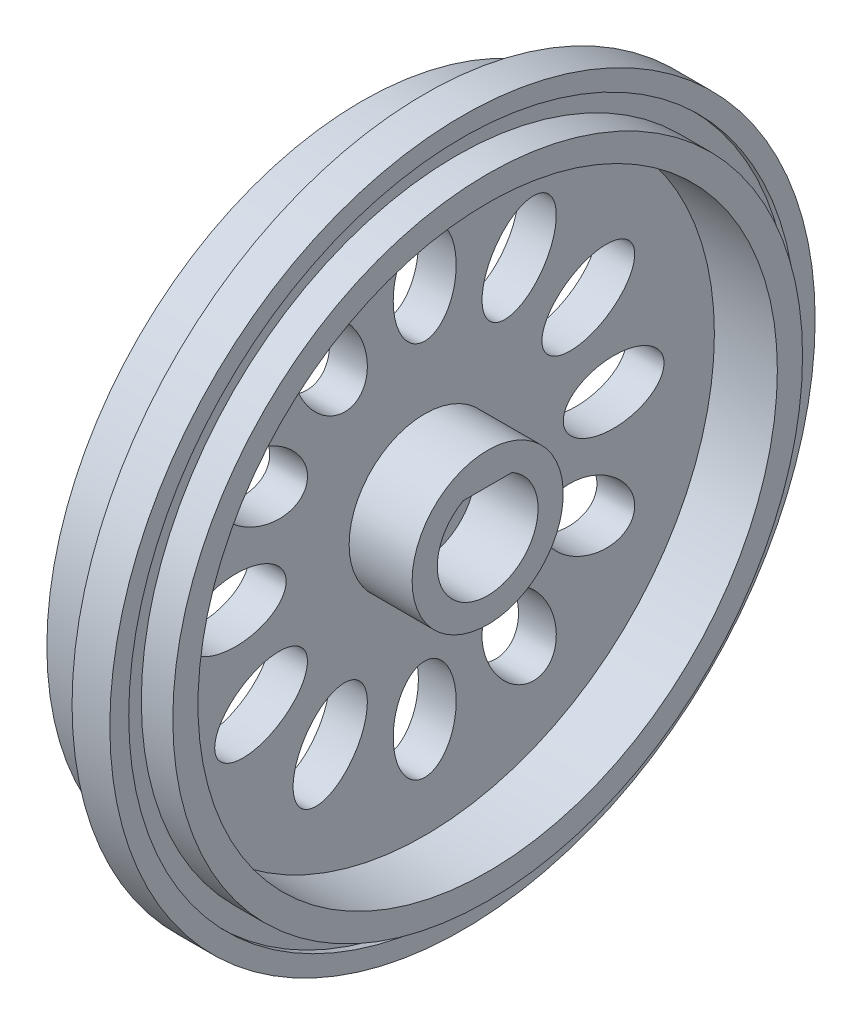
ISO-10303-21;
HEADER;
FILE_DESCRIPTION(('STEP AP214'),'2;1');
FILE_NAME('part.step','',(''),(''),'','','');
FILE_SCHEMA(('AUTOMOTIVE_DESIGN { 1 0 10303 214 1 1 1 1 }'));
ENDSEC;
DATA;
#1=APPLICATION_CONTEXT('core data for automotive mechanical design processes');
#2=APPLICATION_PROTOCOL_DEFINITION('international standard','automotive_design',2000,#1);
#3=PRODUCT_CONTEXT('',#1,'mechanical');
#4=PRODUCT('Part','Part','',(#3));
#5=PRODUCT_RELATED_PRODUCT_CATEGORY('part','',(#4));
#6=PRODUCT_DEFINITION_FORMATION('','',#4);
#7=PRODUCT_DEFINITION_CONTEXT('part definition',#1,'design');
#8=PRODUCT_DEFINITION('design','',#6,#7);
#9=PRODUCT_DEFINITION_SHAPE('','',#8);
#10=(LENGTH_UNIT() NAMED_UNIT(*) SI_UNIT(.MILLI.,.METRE.));
#11=(NAMED_UNIT(*) PLANE_ANGLE_UNIT() SI_UNIT($,.RADIAN.));
#12=(NAMED_UNIT(*) SI_UNIT($,.STERADIAN.) SOLID_ANGLE_UNIT());
#13=UNCERTAINTY_MEASURE_WITH_UNIT(LENGTH_MEASURE(1.E-05),#10,'distance_accuracy_value','');
#14=(GEOMETRIC_REPRESENTATION_CONTEXT(3) GLOBAL_UNCERTAINTY_ASSIGNED_CONTEXT((#13)) GLOBAL_UNIT_ASSIGNED_CONTEXT((#10,
#11,#12)) REPRESENTATION_CONTEXT('',''));
#15=CARTESIAN_POINT('',(0.,0.,0.));
#16=DIRECTION('',(0.,0.,1.));
#17=DIRECTION('',(1.,0.,0.));
#18=AXIS2_PLACEMENT_3D('',#15,#16,#17);
#19=CARTESIAN_POINT('',(-5.,0.,0.));
#20=DIRECTION('',(1.,0.,0.));
#21=DIRECTION('',(0.,0.,-1.));
#22=AXIS2_PLACEMENT_3D('',#19,#20,#21);
#23=PLANE('',#22);
#24=CARTESIAN_POINT('',(-5.,0.,0.));
#25=DIRECTION('',(-1.,0.,0.));
#26=DIRECTION('',(0.,0.,1.));
#27=AXIS2_PLACEMENT_3D('',#24,#25,#26);
#28=CIRCLE('',#27,23.);
#29=CARTESIAN_POINT('',(-5.,0.,23.));
#30=VERTEX_POINT('',#29);
#31=EDGE_CURVE('E97',#30,#30,#28,.T.);
#32=ORIENTED_EDGE('',*,*,#31,.F.);
#33=EDGE_LOOP('',(#32));
#34=FACE_BOUND('',#33,.T.);
#35=CARTESIAN_POINT('',(-5.,0.,0.));
#36=DIRECTION('',(-1.,0.,0.));
#37=DIRECTION('',(0.,0.,1.));
#38=AXIS2_PLACEMENT_3D('',#35,#36,#37);
#39=CIRCLE('',#38,25.);
#40=CARTESIAN_POINT('',(-5.,0.,25.));
#41=VERTEX_POINT('',#40);
#42=EDGE_CURVE('E12',#41,#41,#39,.T.);
#43=ORIENTED_EDGE('',*,*,#42,.T.);
#44=EDGE_LOOP('',(#43));
#45=FACE_BOUND('',#44,.T.);
#46=ADVANCED_FACE('F47',(#34,#45),#23,.F.);
#47=CARTESIAN_POINT('',(0.,0.,0.));
#48=DIRECTION('',(-1.,0.,0.));
#49=DIRECTION('',(0.,0.,1.));
#50=AXIS2_PLACEMENT_3D('',#47,#48,#49);
#51=CYLINDRICAL_SURFACE('',#50,25.);
#52=ORIENTED_EDGE('',*,*,#42,.F.);
#53=EDGE_LOOP('',(#52));
#54=FACE_BOUND('',#53,.T.);
#55=CARTESIAN_POINT('',(0.499999999999995,0.,0.));
#56=DIRECTION('',(-1.,0.,0.));
#57=DIRECTION('',(0.,0.,1.));
#58=AXIS2_PLACEMENT_3D('',#55,#56,#57);
#59=CIRCLE('',#58,25.);
#60=CARTESIAN_POINT('',(0.499999999999995,0.,25.));
#61=VERTEX_POINT('',#60);
#62=EDGE_CURVE('E54',#61,#61,#59,.T.);
#63=ORIENTED_EDGE('',*,*,#62,.T.);
#64=EDGE_LOOP('',(#63));
#65=FACE_BOUND('',#64,.T.);
#66=ADVANCED_FACE('F135',(#54,#65),#51,.T.);
#67=CARTESIAN_POINT('',(0.499999999999995,0.,-25.));
#68=DIRECTION('',(1.,0.,0.));
#69=DIRECTION('',(0.,0.,-1.));
#70=AXIS2_PLACEMENT_3D('',#67,#68,#69);
#71=PLANE('',#70);
#72=ORIENTED_EDGE('',*,*,#62,.F.);
#73=EDGE_LOOP('',(#72));
#74=FACE_BOUND('',#73,.T.);
#75=CARTESIAN_POINT('',(0.499999999999995,0.,0.));
#76=DIRECTION('',(-1.,0.,0.));
#77=DIRECTION('',(0.,0.,1.));
#78=AXIS2_PLACEMENT_3D('',#75,#76,#77);
#79=CIRCLE('',#78,26.5);
#80=CARTESIAN_POINT('',(0.499999999999995,0.,26.5));
#81=VERTEX_POINT('',#80);
#82=EDGE_CURVE('E130',#81,#81,#79,.T.);
#83=ORIENTED_EDGE('',*,*,#82,.T.);
#84=EDGE_LOOP('',(#83));
#85=FACE_BOUND('',#84,.T.);
#86=ADVANCED_FACE('F137',(#74,#85),#71,.F.);
#87=CARTESIAN_POINT('',(0.,0.,0.));
#88=DIRECTION('',(-1.,0.,0.));
#89=DIRECTION('',(0.,0.,1.));
#90=AXIS2_PLACEMENT_3D('',#87,#88,#89);
#91=CYLINDRICAL_SURFACE('',#90,26.5);
#92=ORIENTED_EDGE('',*,*,#82,.F.);
#93=EDGE_LOOP('',(#92));
#94=FACE_BOUND('',#93,.T.);
#95=CARTESIAN_POINT('',(0.,0.,0.));
#96=DIRECTION('',(-1.,0.,0.));
#97=DIRECTION('',(0.,0.,1.));
#98=AXIS2_PLACEMENT_3D('',#95,#96,#97);
#99=CIRCLE('',#98,26.5);
#100=CARTESIAN_POINT('',(0.,0.,26.5));
#101=VERTEX_POINT('',#100);
#102=EDGE_CURVE('E127',#101,#101,#99,.T.);
#103=ORIENTED_EDGE('',*,*,#102,.T.);
#104=EDGE_LOOP('',(#103));
#105=FACE_BOUND('',#104,.T.);
#106=ADVANCED_FACE('F140',(#94,#105),#91,.F.);
#107=CARTESIAN_POINT('',(0.,0.,-26.5));
#108=DIRECTION('',(1.,0.,0.));
#109=DIRECTION('',(0.,0.,-1.));
#110=AXIS2_PLACEMENT_3D('',#107,#108,#109);
#111=PLANE('',#110);
#112=ORIENTED_EDGE('',*,*,#102,.F.);
#113=EDGE_LOOP('',(#112));
#114=FACE_BOUND('',#113,.T.);
#115=CARTESIAN_POINT('',(0.,0.,0.));
#116=DIRECTION('',(-1.,0.,0.));
#117=DIRECTION('',(0.,0.,1.));
#118=AXIS2_PLACEMENT_3D('',#115,#116,#117);
#119=CIRCLE('',#118,28.);
#120=CARTESIAN_POINT('',(0.,0.,28.));
#121=VERTEX_POINT('',#120);
#122=EDGE_CURVE('E124',#121,#121,#119,.T.);
#123=ORIENTED_EDGE('',*,*,#122,.T.);
#124=EDGE_LOOP('',(#123));
#125=FACE_BOUND('',#124,.T.);
#126=ADVANCED_FACE('F146',(#114,#125),#111,.F.);
#127=CARTESIAN_POINT('',(0.,0.,0.));
#128=DIRECTION('',(-1.,0.,0.));
#129=DIRECTION('',(0.,0.,1.));
#130=AXIS2_PLACEMENT_3D('',#127,#128,#129);
#131=CYLINDRICAL_SURFACE('',#130,28.);
#132=ORIENTED_EDGE('',*,*,#122,.F.);
#133=EDGE_LOOP('',(#132));
#134=FACE_BOUND('',#133,.T.);
#135=CARTESIAN_POINT('',(3.,0.,0.));
#136=DIRECTION('',(-1.,0.,0.));
#137=DIRECTION('',(0.,0.,1.));
#138=AXIS2_PLACEMENT_3D('',#135,#136,#137);
#139=CIRCLE('',#138,28.);
#140=CARTESIAN_POINT('',(3.,0.,28.));
#141=VERTEX_POINT('',#140);
#142=EDGE_CURVE('E121',#141,#141,#139,.T.);
#143=ORIENTED_EDGE('',*,*,#142,.T.);
#144=EDGE_LOOP('',(#143));
#145=FACE_BOUND('',#144,.T.);
#146=ADVANCED_FACE('F152',(#134,#145),#131,.T.);
#147=CARTESIAN_POINT('',(3.,0.,-28.));
#148=DIRECTION('',(-1.,0.,0.));
#149=DIRECTION('',(0.,0.,1.));
#150=AXIS2_PLACEMENT_3D('',#147,#148,#149);
#151=PLANE('',#150);
#152=ORIENTED_EDGE('',*,*,#142,.F.);
#153=EDGE_LOOP('',(#152));
#154=FACE_BOUND('',#153,.T.);
#155=CARTESIAN_POINT('',(3.,0.,0.));
#156=DIRECTION('',(-1.,0.,0.));
#157=DIRECTION('',(0.,0.,1.));
#158=AXIS2_PLACEMENT_3D('',#155,#156,#157);
#159=CIRCLE('',#158,26.5);
#160=CARTESIAN_POINT('',(3.,0.,26.5));
#161=VERTEX_POINT('',#160);
#162=EDGE_CURVE('E118',#161,#161,#159,.T.);
#163=ORIENTED_EDGE('',*,*,#162,.T.);
#164=EDGE_LOOP('',(#163));
#165=FACE_BOUND('',#164,.T.);
#166=ADVANCED_FACE('F158',(#154,#165),#151,.F.);
#167=CARTESIAN_POINT('',(0.,0.,0.));
#168=DIRECTION('',(-1.,0.,0.));
#169=DIRECTION('',(0.,0.,1.));
#170=AXIS2_PLACEMENT_3D('',#167,#168,#169);
#171=CYLINDRICAL_SURFACE('',#170,26.5);
#172=ORIENTED_EDGE('',*,*,#162,.F.);
#173=EDGE_LOOP('',(#172));
#174=FACE_BOUND('',#173,.T.);
#175=CARTESIAN_POINT('',(2.5,0.,0.));
#176=DIRECTION('',(-1.,0.,0.));
#177=DIRECTION('',(0.,0.,1.));
#178=AXIS2_PLACEMENT_3D('',#175,#176,#177);
#179=CIRCLE('',#178,26.5);
#180=CARTESIAN_POINT('',(2.5,0.,26.5));
#181=VERTEX_POINT('',#180);
#182=EDGE_CURVE('E115',#181,#181,#179,.T.);
#183=ORIENTED_EDGE('',*,*,#182,.T.);
#184=EDGE_LOOP('',(#183));
#185=FACE_BOUND('',#184,.T.);
#186=ADVANCED_FACE('F164',(#174,#185),#171,.F.);
#187=CARTESIAN_POINT('',(2.5,0.,-26.5));
#188=DIRECTION('',(-1.,0.,0.));
#189=DIRECTION('',(0.,0.,1.));
#190=AXIS2_PLACEMENT_3D('',#187,#188,#189);
#191=PLANE('',#190);
#192=ORIENTED_EDGE('',*,*,#182,.F.);
#193=EDGE_LOOP('',(#192));
#194=FACE_BOUND('',#193,.T.);
#195=CARTESIAN_POINT('',(2.5,0.,0.));
#196=DIRECTION('',(-1.,0.,0.));
#197=DIRECTION('',(0.,0.,1.));
#198=AXIS2_PLACEMENT_3D('',#195,#196,#197);
#199=CIRCLE('',#198,25.);
#200=CARTESIAN_POINT('',(2.5,0.,25.));
#201=VERTEX_POINT('',#200);
#202=EDGE_CURVE('E112',#201,#201,#199,.T.);
#203=ORIENTED_EDGE('',*,*,#202,.T.);
#204=EDGE_LOOP('',(#203));
#205=FACE_BOUND('',#204,.T.);
#206=ADVANCED_FACE('F170',(#194,#205),#191,.F.);
#207=CARTESIAN_POINT('',(0.,0.,0.));
#208=DIRECTION('',(-1.,0.,0.));
#209=DIRECTION('',(0.,0.,1.));
#210=AXIS2_PLACEMENT_3D('',#207,#208,#209);
#211=CYLINDRICAL_SURFACE('',#210,25.);
#212=ORIENTED_EDGE('',*,*,#202,.F.);
#213=EDGE_LOOP('',(#212));
#214=FACE_BOUND('',#213,.T.);
#215=CARTESIAN_POINT('',(5.,0.,0.));
#216=DIRECTION('',(-1.,0.,0.));
#217=DIRECTION('',(0.,0.,1.));
#218=AXIS2_PLACEMENT_3D('',#215,#216,#217);
#219=CIRCLE('',#218,25.);
#220=CARTESIAN_POINT('',(5.,0.,25.));
#221=VERTEX_POINT('',#220);
#222=EDGE_CURVE('E107',#221,#221,#219,.T.);
#223=ORIENTED_EDGE('',*,*,#222,.T.);
#224=EDGE_LOOP('',(#223));
#225=FACE_BOUND('',#224,.T.);
#226=ADVANCED_FACE('F176',(#214,#225),#211,.T.);
#227=CARTESIAN_POINT('',(5.,0.,-25.));
#228=DIRECTION('',(-1.,0.,0.));
#229=DIRECTION('',(0.,0.,1.));
#230=AXIS2_PLACEMENT_3D('',#227,#228,#229);
#231=PLANE('',#230);
#232=CARTESIAN_POINT('',(5.,0.,0.));
#233=DIRECTION('',(1.,0.,0.));
#234=DIRECTION('',(0.,0.,-1.));
#235=AXIS2_PLACEMENT_3D('',#232,#233,#234);
#236=CIRCLE('',#235,23.);
#237=CARTESIAN_POINT('',(5.,0.,-23.));
#238=VERTEX_POINT('',#237);
#239=EDGE_CURVE('E101',#238,#238,#236,.T.);
#240=ORIENTED_EDGE('',*,*,#239,.F.);
#241=EDGE_LOOP('',(#240));
#242=FACE_BOUND('',#241,.T.);
#243=ORIENTED_EDGE('',*,*,#222,.F.);
#244=EDGE_LOOP('',(#243));
#245=FACE_BOUND('',#244,.T.);
#246=ADVANCED_FACE('F182',(#242,#245),#231,.F.);
#247=CARTESIAN_POINT('',(0.,0.,0.));
#248=DIRECTION('',(1.,0.,0.));
#249=DIRECTION('',(0.,0.,-1.));
#250=AXIS2_PLACEMENT_3D('',#247,#248,#249);
#251=CYLINDRICAL_SURFACE('',#250,23.);
#252=CARTESIAN_POINT('',(0.,0.,0.));
#253=DIRECTION('',(1.,0.,0.));
#254=DIRECTION('',(0.,0.,-1.));
#255=AXIS2_PLACEMENT_3D('',#252,#253,#254);
#256=CIRCLE('',#255,23.);
#257=CARTESIAN_POINT('',(0.,0.,-23.));
#258=VERTEX_POINT('',#257);
#259=EDGE_CURVE('E104',#258,#258,#256,.T.);
#260=ORIENTED_EDGE('',*,*,#259,.F.);
#261=EDGE_LOOP('',(#260));
#262=FACE_BOUND('',#261,.T.);
#263=ORIENTED_EDGE('',*,*,#239,.T.);
#264=EDGE_LOOP('',(#263));
#265=FACE_BOUND('',#264,.T.);
#266=ADVANCED_FACE('F187',(#262,#265),#251,.F.);
#267=CARTESIAN_POINT('',(0.,0.,0.));
#268=DIRECTION('',(1.,0.,0.));
#269=DIRECTION('',(0.,0.,-1.));
#270=AXIS2_PLACEMENT_3D('',#267,#268,#269);
#271=PLANE('',#270);
#272=CARTESIAN_POINT('',(0.,7.49999999999997,12.9903810567666));
#273=DIRECTION('',(1.,0.,0.));
#274=DIRECTION('',(0.,-0.499999999999998,-0.86602540378444));
#275=AXIS2_PLACEMENT_3D('',#272,#273,#274);
#276=ELLIPSE('',#275,4.,2.5);
#277=CARTESIAN_POINT('',(0.,5.49999999999998,9.52627944162884));
#278=VERTEX_POINT('',#277);
#279=EDGE_CURVE('E377',#278,#278,#276,.T.);
#280=ORIENTED_EDGE('',*,*,#279,.F.);
#281=EDGE_LOOP('',(#280));
#282=FACE_BOUND('',#281,.T.);
#283=CARTESIAN_POINT('',(0.,0.,15.));
#284=DIRECTION('',(1.,0.,0.));
#285=DIRECTION('',(0.,0.,-1.));
#286=AXIS2_PLACEMENT_3D('',#283,#284,#285);
#287=ELLIPSE('',#286,4.,2.5);
#288=CARTESIAN_POINT('',(0.,0.,11.));
#289=VERTEX_POINT('',#288);
#290=EDGE_CURVE('E344',#289,#289,#287,.T.);
#291=ORIENTED_EDGE('',*,*,#290,.F.);
#292=EDGE_LOOP('',(#291));
#293=FACE_BOUND('',#292,.T.);
#294=CARTESIAN_POINT('',(0.,-12.9903810567666,7.49999999999992));
#295=DIRECTION('',(1.,0.,0.));
#296=DIRECTION('',(0.,0.866025403784442,-0.499999999999995));
#297=AXIS2_PLACEMENT_3D('',#294,#295,#296);
#298=ELLIPSE('',#297,4.,2.5);
#299=CARTESIAN_POINT('',(0.,-9.52627944162886,5.49999999999994));
#300=VERTEX_POINT('',#299);
#301=EDGE_CURVE('E352',#300,#300,#298,.T.);
#302=ORIENTED_EDGE('',*,*,#301,.F.);
#303=EDGE_LOOP('',(#302));
#304=FACE_BOUND('',#303,.T.);
#305=CARTESIAN_POINT('',(0.,-7.50000000000006,12.9903810567665));
#306=DIRECTION('',(1.,0.,0.));
#307=DIRECTION('',(0.,0.500000000000004,-0.866025403784436));
#308=AXIS2_PLACEMENT_3D('',#305,#306,#307);
#309=ELLIPSE('',#308,4.,2.5);
#310=CARTESIAN_POINT('',(0.,-5.50000000000004,9.5262794416288));
#311=VERTEX_POINT('',#310);
#312=EDGE_CURVE('E345',#311,#311,#309,.T.);
#313=ORIENTED_EDGE('',*,*,#312,.F.);
#314=EDGE_LOOP('',(#313));
#315=FACE_BOUND('',#314,.T.);
#316=CARTESIAN_POINT('',(0.,1.57116660247941E-13,-15.));
#317=DIRECTION('',(1.,0.,0.));
#318=DIRECTION('',(0.,0.,1.));
#319=AXIS2_PLACEMENT_3D('',#316,#317,#318);
#320=ELLIPSE('',#319,4.,2.5);
#321=CARTESIAN_POINT('',(0.,1.15218884181823E-13,-11.));
#322=VERTEX_POINT('',#321);
#323=EDGE_CURVE('E327',#322,#322,#320,.T.);
#324=ORIENTED_EDGE('',*,*,#323,.F.);
#325=EDGE_LOOP('',(#324));
#326=FACE_BOUND('',#325,.T.);
#327=CARTESIAN_POINT('',(0.,-7.49999999999988,-12.9903810567666));
#328=DIRECTION('',(1.,0.,0.));
#329=DIRECTION('',(0.,0.499999999999992,0.866025403784443));
#330=AXIS2_PLACEMENT_3D('',#327,#328,#329);
#331=ELLIPSE('',#330,4.,2.5);
#332=CARTESIAN_POINT('',(0.,-5.49999999999991,-9.52627944162888));
#333=VERTEX_POINT('',#332);
#334=EDGE_CURVE('E316',#333,#333,#331,.T.);
#335=ORIENTED_EDGE('',*,*,#334,.F.);
#336=EDGE_LOOP('',(#335));
#337=FACE_BOUND('',#336,.T.);
#338=CARTESIAN_POINT('',(0.,-12.9903810567665,-7.50000000000011));
#339=DIRECTION('',(1.,0.,0.));
#340=DIRECTION('',(0.,0.866025403784435,0.500000000000007));
#341=AXIS2_PLACEMENT_3D('',#338,#339,#340);
#342=ELLIPSE('',#341,4.,2.5);
#343=CARTESIAN_POINT('',(0.,-9.52627944162878,-5.50000000000008));
#344=VERTEX_POINT('',#343);
#345=EDGE_CURVE('E309',#344,#344,#342,.T.);
#346=ORIENTED_EDGE('',*,*,#345,.F.);
#347=EDGE_LOOP('',(#346));
#348=FACE_BOUND('',#347,.T.);
#349=CARTESIAN_POINT('',(0.,-15.,0.));
#350=DIRECTION('',(1.,0.,0.));
#351=DIRECTION('',(0.,1.,0.));
#352=AXIS2_PLACEMENT_3D('',#349,#350,#351);
#353=ELLIPSE('',#352,4.,2.5);
#354=CARTESIAN_POINT('',(0.,-11.,0.));
#355=VERTEX_POINT('',#354);
#356=EDGE_CURVE('E314',#355,#355,#353,.T.);
#357=ORIENTED_EDGE('',*,*,#356,.F.);
#358=EDGE_LOOP('',(#357));
#359=FACE_BOUND('',#358,.T.);
#360=CARTESIAN_POINT('',(0.,12.9903810567667,-7.49999999999983));
#361=DIRECTION('',(1.,0.,0.));
#362=DIRECTION('',(0.,-0.866025403784445,0.499999999999989));
#363=AXIS2_PLACEMENT_3D('',#360,#361,#362);
#364=ELLIPSE('',#363,4.,2.5);
#365=CARTESIAN_POINT('',(0.,9.5262794416289,-5.49999999999988));
#366=VERTEX_POINT('',#365);
#367=EDGE_CURVE('E404',#366,#366,#364,.T.);
#368=ORIENTED_EDGE('',*,*,#367,.F.);
#369=EDGE_LOOP('',(#368));
#370=FACE_BOUND('',#369,.T.);
#371=CARTESIAN_POINT('',(0.,7.50000000000015,-12.9903810567665));
#372=DIRECTION('',(1.,0.,0.));
#373=DIRECTION('',(0.,-0.50000000000001,0.866025403784433));
#374=AXIS2_PLACEMENT_3D('',#371,#372,#373);
#375=ELLIPSE('',#374,4.,2.5);
#376=CARTESIAN_POINT('',(0.,5.50000000000011,-9.52627944162876));
#377=VERTEX_POINT('',#376);
#378=EDGE_CURVE('E388',#377,#377,#375,.T.);
#379=ORIENTED_EDGE('',*,*,#378,.F.);
#380=EDGE_LOOP('',(#379));
#381=FACE_BOUND('',#380,.T.);
#382=CARTESIAN_POINT('',(0.,12.9903810567666,7.50000000000001));
#383=DIRECTION('',(1.,0.,0.));
#384=DIRECTION('',(0.,-0.866025403784438,-0.500000000000001));
#385=AXIS2_PLACEMENT_3D('',#382,#383,#384);
#386=ELLIPSE('',#385,4.,2.5);
#387=CARTESIAN_POINT('',(0.,9.52627944162882,5.50000000000001));
#388=VERTEX_POINT('',#387);
#389=EDGE_CURVE('E280',#388,#388,#386,.T.);
#390=ORIENTED_EDGE('',*,*,#389,.F.);
#391=EDGE_LOOP('',(#390));
#392=FACE_BOUND('',#391,.T.);
#393=CARTESIAN_POINT('',(0.,15.,0.));
#394=DIRECTION('',(1.,0.,0.));
#395=DIRECTION('',(0.,-1.,0.));
#396=AXIS2_PLACEMENT_3D('',#393,#394,#395);
#397=ELLIPSE('',#396,4.,2.5);
#398=CARTESIAN_POINT('',(0.,11.,0.));
#399=VERTEX_POINT('',#398);
#400=EDGE_CURVE('E273',#399,#399,#397,.T.);
#401=ORIENTED_EDGE('',*,*,#400,.F.);
#402=EDGE_LOOP('',(#401));
#403=FACE_BOUND('',#402,.T.);
#404=CARTESIAN_POINT('',(0.,0.,0.));
#405=DIRECTION('',(1.,0.,0.));
#406=DIRECTION('',(0.,0.,-1.));
#407=AXIS2_PLACEMENT_3D('',#404,#405,#406);
#408=CIRCLE('',#407,6.);
#409=CARTESIAN_POINT('',(0.,0.,-6.));
#410=VERTEX_POINT('',#409);
#411=EDGE_CURVE('E91',#410,#410,#408,.T.);
#412=ORIENTED_EDGE('',*,*,#411,.F.);
#413=EDGE_LOOP('',(#412));
#414=FACE_BOUND('',#413,.T.);
#415=ORIENTED_EDGE('',*,*,#259,.T.);
#416=EDGE_LOOP('',(#415));
#417=FACE_BOUND('',#416,.T.);
#418=ADVANCED_FACE('F193',(#282,#293,#304,#315,#326,#337,#348,#359,#370,#381,#392,#403,#414,
#417),#271,.T.);
#419=CARTESIAN_POINT('',(-3.,0.,0.));
#420=DIRECTION('',(-1.,0.,0.));
#421=DIRECTION('',(0.,0.,1.));
#422=AXIS2_PLACEMENT_3D('',#419,#420,#421);
#423=CYLINDRICAL_SURFACE('',#422,23.);
#424=CARTESIAN_POINT('',(-3.,0.,0.));
#425=DIRECTION('',(-1.,0.,0.));
#426=DIRECTION('',(0.,0.,1.));
#427=AXIS2_PLACEMENT_3D('',#424,#425,#426);
#428=CIRCLE('',#427,23.);
#429=CARTESIAN_POINT('',(-3.,0.,23.));
#430=VERTEX_POINT('',#429);
#431=EDGE_CURVE('E98',#430,#430,#428,.T.);
#432=ORIENTED_EDGE('',*,*,#431,.F.);
#433=EDGE_LOOP('',(#432));
#434=FACE_BOUND('',#433,.T.);
#435=ORIENTED_EDGE('',*,*,#31,.T.);
#436=EDGE_LOOP('',(#435));
#437=FACE_BOUND('',#436,.T.);
#438=ADVANCED_FACE('F207',(#434,#437),#423,.F.);
#439=CARTESIAN_POINT('',(-3.,0.,0.));
#440=DIRECTION('',(-1.,0.,0.));
#441=DIRECTION('',(0.,0.,1.));
#442=AXIS2_PLACEMENT_3D('',#439,#440,#441);
#443=PLANE('',#442);
#444=CARTESIAN_POINT('',(-3.,7.49999999999997,12.9903810567666));
#445=DIRECTION('',(1.,0.,0.));
#446=DIRECTION('',(0.,-0.499999999999998,-0.86602540378444));
#447=AXIS2_PLACEMENT_3D('',#444,#445,#446);
#448=ELLIPSE('',#447,4.,2.5);
#449=CARTESIAN_POINT('',(-3.,5.49999999999998,9.52627944162884));
#450=VERTEX_POINT('',#449);
#451=EDGE_CURVE('E286',#450,#450,#448,.T.);
#452=ORIENTED_EDGE('',*,*,#451,.T.);
#453=EDGE_LOOP('',(#452));
#454=FACE_BOUND('',#453,.T.);
#455=CARTESIAN_POINT('',(-3.,0.,15.));
#456=DIRECTION('',(1.,0.,0.));
#457=DIRECTION('',(0.,0.,-1.));
#458=AXIS2_PLACEMENT_3D('',#455,#456,#457);
#459=ELLIPSE('',#458,4.,2.5);
#460=CARTESIAN_POINT('',(-3.,0.,11.));
#461=VERTEX_POINT('',#460);
#462=EDGE_CURVE('E357',#461,#461,#459,.T.);
#463=ORIENTED_EDGE('',*,*,#462,.T.);
#464=EDGE_LOOP('',(#463));
#465=FACE_BOUND('',#464,.T.);
#466=CARTESIAN_POINT('',(-3.,-12.9903810567666,7.49999999999992));
#467=DIRECTION('',(1.,0.,0.));
#468=DIRECTION('',(0.,0.866025403784442,-0.499999999999995));
#469=AXIS2_PLACEMENT_3D('',#466,#467,#468);
#470=ELLIPSE('',#469,4.,2.5);
#471=CARTESIAN_POINT('',(-3.,-9.52627944162886,5.49999999999994));
#472=VERTEX_POINT('',#471);
#473=EDGE_CURVE('E347',#472,#472,#470,.T.);
#474=ORIENTED_EDGE('',*,*,#473,.T.);
#475=EDGE_LOOP('',(#474));
#476=FACE_BOUND('',#475,.T.);
#477=CARTESIAN_POINT('',(-3.,-7.50000000000006,12.9903810567665));
#478=DIRECTION('',(1.,0.,0.));
#479=DIRECTION('',(0.,0.500000000000004,-0.866025403784436));
#480=AXIS2_PLACEMENT_3D('',#477,#478,#479);
#481=ELLIPSE('',#480,4.,2.5);
#482=CARTESIAN_POINT('',(-3.,-5.50000000000004,9.5262794416288));
#483=VERTEX_POINT('',#482);
#484=EDGE_CURVE('E341',#483,#483,#481,.T.);
#485=ORIENTED_EDGE('',*,*,#484,.T.);
#486=EDGE_LOOP('',(#485));
#487=FACE_BOUND('',#486,.T.);
#488=CARTESIAN_POINT('',(-3.,1.57116660247941E-13,-15.));
#489=DIRECTION('',(1.,0.,0.));
#490=DIRECTION('',(0.,0.,1.));
#491=AXIS2_PLACEMENT_3D('',#488,#489,#490);
#492=ELLIPSE('',#491,4.,2.5);
#493=CARTESIAN_POINT('',(-3.,1.15218884181823E-13,-11.));
#494=VERTEX_POINT('',#493);
#495=EDGE_CURVE('E321',#494,#494,#492,.T.);
#496=ORIENTED_EDGE('',*,*,#495,.T.);
#497=EDGE_LOOP('',(#496));
#498=FACE_BOUND('',#497,.T.);
#499=CARTESIAN_POINT('',(-3.,-7.49999999999988,-12.9903810567666));
#500=DIRECTION('',(1.,0.,0.));
#501=DIRECTION('',(0.,0.499999999999992,0.866025403784443));
#502=AXIS2_PLACEMENT_3D('',#499,#500,#501);
#503=ELLIPSE('',#502,4.,2.5);
#504=CARTESIAN_POINT('',(-3.,-5.49999999999991,-9.52627944162888));
#505=VERTEX_POINT('',#504);
#506=EDGE_CURVE('E311',#505,#505,#503,.T.);
#507=ORIENTED_EDGE('',*,*,#506,.T.);
#508=EDGE_LOOP('',(#507));
#509=FACE_BOUND('',#508,.T.);
#510=CARTESIAN_POINT('',(-3.,-12.9903810567665,-7.50000000000011));
#511=DIRECTION('',(1.,0.,0.));
#512=DIRECTION('',(0.,0.866025403784435,0.500000000000007));
#513=AXIS2_PLACEMENT_3D('',#510,#511,#512);
#514=ELLIPSE('',#513,4.,2.5);
#515=CARTESIAN_POINT('',(-3.,-9.52627944162878,-5.50000000000008));
#516=VERTEX_POINT('',#515);
#517=EDGE_CURVE('E289',#516,#516,#514,.T.);
#518=ORIENTED_EDGE('',*,*,#517,.T.);
#519=EDGE_LOOP('',(#518));
#520=FACE_BOUND('',#519,.T.);
#521=CARTESIAN_POINT('',(-3.,-15.,0.));
#522=DIRECTION('',(1.,0.,0.));
#523=DIRECTION('',(0.,1.,0.));
#524=AXIS2_PLACEMENT_3D('',#521,#522,#523);
#525=ELLIPSE('',#524,4.,2.5);
#526=CARTESIAN_POINT('',(-3.,-11.,0.));
#527=VERTEX_POINT('',#526);
#528=EDGE_CURVE('E307',#527,#527,#525,.T.);
#529=ORIENTED_EDGE('',*,*,#528,.T.);
#530=EDGE_LOOP('',(#529));
#531=FACE_BOUND('',#530,.T.);
#532=CARTESIAN_POINT('',(-3.,12.9903810567667,-7.49999999999983));
#533=DIRECTION('',(1.,0.,0.));
#534=DIRECTION('',(0.,-0.866025403784445,0.499999999999989));
#535=AXIS2_PLACEMENT_3D('',#532,#533,#534);
#536=ELLIPSE('',#535,4.,2.5);
#537=CARTESIAN_POINT('',(-3.,9.5262794416289,-5.49999999999988));
#538=VERTEX_POINT('',#537);
#539=EDGE_CURVE('E391',#538,#538,#536,.T.);
#540=ORIENTED_EDGE('',*,*,#539,.T.);
#541=EDGE_LOOP('',(#540));
#542=FACE_BOUND('',#541,.T.);
#543=CARTESIAN_POINT('',(-3.,7.50000000000015,-12.9903810567665));
#544=DIRECTION('',(1.,0.,0.));
#545=DIRECTION('',(0.,-0.50000000000001,0.866025403784433));
#546=AXIS2_PLACEMENT_3D('',#543,#544,#545);
#547=ELLIPSE('',#546,4.,2.5);
#548=CARTESIAN_POINT('',(-3.,5.50000000000011,-9.52627944162876));
#549=VERTEX_POINT('',#548);
#550=EDGE_CURVE('E385',#549,#549,#547,.T.);
#551=ORIENTED_EDGE('',*,*,#550,.T.);
#552=EDGE_LOOP('',(#551));
#553=FACE_BOUND('',#552,.T.);
#554=CARTESIAN_POINT('',(-3.,12.9903810567666,7.50000000000001));
#555=DIRECTION('',(1.,0.,0.));
#556=DIRECTION('',(0.,-0.866025403784438,-0.500000000000001));
#557=AXIS2_PLACEMENT_3D('',#554,#555,#556);
#558=ELLIPSE('',#557,4.,2.5);
#559=CARTESIAN_POINT('',(-3.,9.52627944162882,5.50000000000001));
#560=VERTEX_POINT('',#559);
#561=EDGE_CURVE('E277',#560,#560,#558,.T.);
#562=ORIENTED_EDGE('',*,*,#561,.T.);
#563=EDGE_LOOP('',(#562));
#564=FACE_BOUND('',#563,.T.);
#565=CARTESIAN_POINT('',(-3.,15.,0.));
#566=DIRECTION('',(1.,0.,0.));
#567=DIRECTION('',(0.,-1.,0.));
#568=AXIS2_PLACEMENT_3D('',#565,#566,#567);
#569=ELLIPSE('',#568,4.,2.5);
#570=CARTESIAN_POINT('',(-3.,11.,0.));
#571=VERTEX_POINT('',#570);
#572=EDGE_CURVE('E252',#571,#571,#569,.T.);
#573=ORIENTED_EDGE('',*,*,#572,.T.);
#574=EDGE_LOOP('',(#573));
#575=FACE_BOUND('',#574,.T.);
#576=CARTESIAN_POINT('',(-3.,0.,0.));
#577=DIRECTION('',(-1.,0.,0.));
#578=DIRECTION('',(0.,0.,1.));
#579=AXIS2_PLACEMENT_3D('',#576,#577,#578);
#580=CIRCLE('',#579,1.5);
#581=CARTESIAN_POINT('',(-3.,0.,1.5));
#582=VERTEX_POINT('',#581);
#583=EDGE_CURVE('E254',#582,#582,#580,.T.);
#584=ORIENTED_EDGE('',*,*,#583,.F.);
#585=EDGE_LOOP('',(#584));
#586=FACE_BOUND('',#585,.T.);
#587=ORIENTED_EDGE('',*,*,#431,.T.);
#588=EDGE_LOOP('',(#587));
#589=FACE_BOUND('',#588,.T.);
#590=ADVANCED_FACE('F209',(#454,#465,#476,#487,#498,#509,#520,#531,#542,#553,#564,#575,#586,
#589),#443,.T.);
#591=CARTESIAN_POINT('',(21.9705627484771,0.,0.));
#592=DIRECTION('',(-1.,0.,0.));
#593=DIRECTION('',(0.,0.,1.));
#594=AXIS2_PLACEMENT_3D('',#591,#592,#593);
#595=CYLINDRICAL_SURFACE('',#594,6.);
#596=CARTESIAN_POINT('',(5.,0.,0.));
#597=DIRECTION('',(-1.,0.,0.));
#598=DIRECTION('',(0.,0.,1.));
#599=AXIS2_PLACEMENT_3D('',#596,#597,#598);
#600=CIRCLE('',#599,6.);
#601=CARTESIAN_POINT('',(5.,0.,6.));
#602=VERTEX_POINT('',#601);
#603=EDGE_CURVE('E94',#602,#602,#600,.T.);
#604=ORIENTED_EDGE('',*,*,#603,.T.);
#605=EDGE_LOOP('',(#604));
#606=FACE_BOUND('',#605,.T.);
#607=ORIENTED_EDGE('',*,*,#411,.T.);
#608=EDGE_LOOP('',(#607));
#609=FACE_BOUND('',#608,.T.);
#610=ADVANCED_FACE('F216',(#606,#609),#595,.T.);
#611=CARTESIAN_POINT('',(5.,0.,-25.));
#612=DIRECTION('',(-1.,0.,0.));
#613=DIRECTION('',(0.,0.,1.));
#614=AXIS2_PLACEMENT_3D('',#611,#612,#613);
#615=PLANE('',#614);
#616=CARTESIAN_POINT('',(5.,0.,0.));
#617=DIRECTION('',(1.,0.,0.));
#618=DIRECTION('',(0.,0.,-1.));
#619=AXIS2_PLACEMENT_3D('',#616,#617,#618);
#620=CIRCLE('',#619,4.);
#621=CARTESIAN_POINT('',(5.,3.5,1.93649167310371));
#622=VERTEX_POINT('',#621);
#623=CARTESIAN_POINT('',(5.,3.5,-1.93649167310371));
#624=VERTEX_POINT('',#623);
#625=EDGE_CURVE('E86',#622,#624,#620,.T.);
#626=ORIENTED_EDGE('',*,*,#625,.F.);
#627=DIRECTION('',(0.,0.,1.));
#628=VECTOR('',#627,1.);
#629=CARTESIAN_POINT('',(5.,3.5,1.93649167310371));
#630=LINE('',#629,#628);
#631=EDGE_CURVE('E61',#624,#622,#630,.T.);
#632=ORIENTED_EDGE('',*,*,#631,.F.);
#633=EDGE_LOOP('',(#626,#632));
#634=FACE_BOUND('',#633,.T.);
#635=ORIENTED_EDGE('',*,*,#603,.F.);
#636=EDGE_LOOP('',(#635));
#637=FACE_BOUND('',#636,.T.);
#638=ADVANCED_FACE('F225',(#634,#637),#615,.F.);
#639=CARTESIAN_POINT('',(0.,0.,0.));
#640=DIRECTION('',(-1.,0.,0.));
#641=DIRECTION('',(0.,0.,1.));
#642=AXIS2_PLACEMENT_3D('',#639,#640,#641);
#643=PLANE('',#642);
#644=CARTESIAN_POINT('',(0.,0.,0.));
#645=DIRECTION('',(-1.,0.,0.));
#646=DIRECTION('',(0.,0.,1.));
#647=AXIS2_PLACEMENT_3D('',#644,#645,#646);
#648=CIRCLE('',#647,1.5);
#649=CARTESIAN_POINT('',(0.,0.,1.5));
#650=VERTEX_POINT('',#649);
#651=EDGE_CURVE('E257',#650,#650,#648,.F.);
#652=ORIENTED_EDGE('',*,*,#651,.F.);
#653=EDGE_LOOP('',(#652));
#654=FACE_BOUND('',#653,.T.);
#655=CARTESIAN_POINT('',(0.,0.,0.));
#656=DIRECTION('',(-1.,0.,0.));
#657=DIRECTION('',(0.,0.,1.));
#658=AXIS2_PLACEMENT_3D('',#655,#656,#657);
#659=CIRCLE('',#658,4.);
#660=CARTESIAN_POINT('',(0.,3.5,1.93649167310371));
#661=VERTEX_POINT('',#660);
#662=CARTESIAN_POINT('',(0.,3.5,-1.93649167310371));
#663=VERTEX_POINT('',#662);
#664=EDGE_CURVE('E74',#661,#663,#659,.F.);
#665=ORIENTED_EDGE('',*,*,#664,.T.);
#666=DIRECTION('',(0.,0.,1.));
#667=VECTOR('',#666,1.);
#668=CARTESIAN_POINT('',(0.,3.5,1.93649167310371));
#669=LINE('',#668,#667);
#670=EDGE_CURVE('E82',#663,#661,#669,.T.);
#671=ORIENTED_EDGE('',*,*,#670,.T.);
#672=EDGE_LOOP('',(#665,#671));
#673=FACE_BOUND('',#672,.T.);
#674=ADVANCED_FACE('F84',(#654,#673),#643,.F.);
#675=CARTESIAN_POINT('',(-13.9658560997307,3.5,1.93649167310371));
#676=DIRECTION('',(0.,1.,0.));
#677=DIRECTION('',(0.,0.,1.));
#678=AXIS2_PLACEMENT_3D('',#675,#676,#677);
#679=PLANE('',#678);
#680=DIRECTION('',(1.,0.,0.));
#681=VECTOR('',#680,1.);
#682=CARTESIAN_POINT('',(-13.9658560997307,3.5,-1.93649167310371));
#683=LINE('',#682,#681);
#684=EDGE_CURVE('E67',#663,#624,#683,.T.);
#685=ORIENTED_EDGE('',*,*,#684,.T.);
#686=ORIENTED_EDGE('',*,*,#631,.T.);
#687=DIRECTION('',(1.,0.,0.));
#688=VECTOR('',#687,1.);
#689=CARTESIAN_POINT('',(-13.9658560997307,3.5,1.93649167310371));
#690=LINE('',#689,#688);
#691=EDGE_CURVE('E76',#661,#622,#690,.T.);
#692=ORIENTED_EDGE('',*,*,#691,.F.);
#693=ORIENTED_EDGE('',*,*,#670,.F.);
#694=EDGE_LOOP('',(#685,#686,#692,#693));
#695=FACE_BOUND('',#694,.T.);
#696=ADVANCED_FACE('F81',(#695),#679,.F.);
#697=CARTESIAN_POINT('',(-13.9658560997307,0.,0.));
#698=DIRECTION('',(1.,0.,0.));
#699=DIRECTION('',(0.,0.,-1.));
#700=AXIS2_PLACEMENT_3D('',#697,#698,#699);
#701=CYLINDRICAL_SURFACE('',#700,4.);
#702=ORIENTED_EDGE('',*,*,#691,.T.);
#703=ORIENTED_EDGE('',*,*,#625,.T.);
#704=ORIENTED_EDGE('',*,*,#684,.F.);
#705=ORIENTED_EDGE('',*,*,#664,.F.);
#706=EDGE_LOOP('',(#702,#703,#704,#705));
#707=FACE_BOUND('',#706,.T.);
#708=ADVANCED_FACE('F75',(#707),#701,.F.);
#709=CARTESIAN_POINT('',(4.24264068711929,0.,0.));
#710=DIRECTION('',(-1.,0.,0.));
#711=DIRECTION('',(0.,0.,1.));
#712=AXIS2_PLACEMENT_3D('',#709,#710,#711);
#713=CYLINDRICAL_SURFACE('',#712,1.5);
#714=CARTESIAN_POINT('',(0.,0.,1.5));
#715=CARTESIAN_POINT('',(-0.0312499999999992,0.,1.5));
#716=CARTESIAN_POINT('',(-0.0624999999999992,0.,1.5));
#717=CARTESIAN_POINT('',(-0.124999999999999,0.,1.5));
#718=CARTESIAN_POINT('',(-0.156249999999999,0.,1.5));
#719=CARTESIAN_POINT('',(-0.218749999999999,0.,1.5));
#720=CARTESIAN_POINT('',(-0.249999999999999,0.,1.5));
#721=CARTESIAN_POINT('',(-0.312499999999999,0.,1.5));
#722=CARTESIAN_POINT('',(-0.343749999999999,0.,1.5));
#723=CARTESIAN_POINT('',(-0.40625,0.,1.5));
#724=CARTESIAN_POINT('',(-0.4375,0.,1.5));
#725=CARTESIAN_POINT('',(-0.5,0.,1.5));
#726=CARTESIAN_POINT('',(-0.53125,0.,1.5));
#727=CARTESIAN_POINT('',(-0.59375,0.,1.5));
#728=CARTESIAN_POINT('',(-0.625,0.,1.5));
#729=CARTESIAN_POINT('',(-0.6875,0.,1.5));
#730=CARTESIAN_POINT('',(-0.71875,0.,1.5));
#731=CARTESIAN_POINT('',(-0.78125,0.,1.5));
#732=CARTESIAN_POINT('',(-0.8125,0.,1.5));
#733=CARTESIAN_POINT('',(-0.875,0.,1.5));
#734=CARTESIAN_POINT('',(-0.906249999999999,0.,1.5));
#735=CARTESIAN_POINT('',(-0.968749999999999,0.,1.5));
#736=CARTESIAN_POINT('',(-0.999999999999999,0.,1.5));
#737=CARTESIAN_POINT('',(-1.0625,0.,1.5));
#738=CARTESIAN_POINT('',(-1.09375,0.,1.5));
#739=CARTESIAN_POINT('',(-1.15625,0.,1.5));
#740=CARTESIAN_POINT('',(-1.1875,0.,1.5));
#741=CARTESIAN_POINT('',(-1.25,0.,1.5));
#742=CARTESIAN_POINT('',(-1.28125,0.,1.5));
#743=CARTESIAN_POINT('',(-1.34375,0.,1.5));
#744=CARTESIAN_POINT('',(-1.375,0.,1.5));
#745=CARTESIAN_POINT('',(-1.4375,0.,1.5));
#746=CARTESIAN_POINT('',(-1.46875,0.,1.5));
#747=CARTESIAN_POINT('',(-1.53125,0.,1.5));
#748=CARTESIAN_POINT('',(-1.5625,0.,1.5));
#749=CARTESIAN_POINT('',(-1.625,0.,1.5));
#750=CARTESIAN_POINT('',(-1.65625,0.,1.5));
#751=CARTESIAN_POINT('',(-1.71875,0.,1.5));
#752=CARTESIAN_POINT('',(-1.75,0.,1.5));
#753=CARTESIAN_POINT('',(-1.8125,0.,1.5));
#754=CARTESIAN_POINT('',(-1.84375,0.,1.5));
#755=CARTESIAN_POINT('',(-1.90625,0.,1.5));
#756=CARTESIAN_POINT('',(-1.9375,0.,1.5));
#757=CARTESIAN_POINT('',(-2.,0.,1.5));
#758=CARTESIAN_POINT('',(-2.03125,0.,1.5));
#759=CARTESIAN_POINT('',(-2.09375,0.,1.5));
#760=CARTESIAN_POINT('',(-2.125,0.,1.5));
#761=CARTESIAN_POINT('',(-2.1875,0.,1.5));
#762=CARTESIAN_POINT('',(-2.21875,0.,1.5));
#763=CARTESIAN_POINT('',(-2.28125,0.,1.5));
#764=CARTESIAN_POINT('',(-2.3125,0.,1.5));
#765=CARTESIAN_POINT('',(-2.375,0.,1.5));
#766=CARTESIAN_POINT('',(-2.40625,0.,1.5));
#767=CARTESIAN_POINT('',(-2.46875,0.,1.5));
#768=CARTESIAN_POINT('',(-2.5,0.,1.5));
#769=CARTESIAN_POINT('',(-2.5625,0.,1.5));
#770=CARTESIAN_POINT('',(-2.59375,0.,1.5));
#771=CARTESIAN_POINT('',(-2.65625,0.,1.5));
#772=CARTESIAN_POINT('',(-2.6875,0.,1.5));
#773=CARTESIAN_POINT('',(-2.75,0.,1.5));
#774=CARTESIAN_POINT('',(-2.78125,0.,1.5));
#775=CARTESIAN_POINT('',(-2.84375,0.,1.5));
#776=CARTESIAN_POINT('',(-2.875,0.,1.5));
#777=CARTESIAN_POINT('',(-2.9375,0.,1.5));
#778=CARTESIAN_POINT('',(-2.96875,0.,1.5));
#779=CARTESIAN_POINT('',(-3.,0.,1.5));
#780=B_SPLINE_CURVE_WITH_KNOTS('',3,(#714,#715,#716,#717,#718,#719,#720,#721,#722,#723,#724,
#725,#726,#727,#728,#729,#730,#731,#732,#733,#734,#735,#736,#737,#738,#739,#740,#741,#742,#743,
#744,#745,#746,#747,#748,#749,#750,#751,#752,#753,#754,#755,#756,#757,#758,#759,#760,#761,#762,
#763,#764,#765,#766,#767,#768,#769,#770,#771,#772,#773,#774,#775,#776,#777,#778,#779),
.UNSPECIFIED.,.F.,.F.,(4,2,2,2,2,2,2,2,2,2,2,2,2,2,2,2,2,2,2,2,2,2,2,2,2,2,2,2,2,2,2,2,4),(0.,
0.0937500000000001,0.1875,0.28125,0.375,0.46875,0.5625,0.656250000000001,0.750000000000001,
0.843750000000001,0.9375,1.03125,1.125,1.21875,1.3125,1.40625,1.5,1.59375,1.6875,1.78125,1.875,
1.96875,2.0625,2.15625,2.25,2.34375,2.4375,2.53125,2.625,2.71875,2.8125,2.90625,3.),.UNSPECIFIED.);
#781=EDGE_CURVE('BSEAM237',#650,#582,#780,.T.);
#782=ORIENTED_EDGE('',*,*,#651,.T.);
#783=ORIENTED_EDGE('',*,*,#583,.T.);
#784=ORIENTED_EDGE('',*,*,#781,.T.);
#785=ORIENTED_EDGE('',*,*,#781,.F.);
#786=EDGE_LOOP('',(#782,#784,#783,#785));
#787=FACE_BOUND('',#786,.T.);
#788=ADVANCED_FACE('F237',(#787),#713,.F.);
#789=CARTESIAN_POINT('',(-12.4339811320566,15.,0.));
#790=DIRECTION('',(1.,0.,0.));
#791=DIRECTION('',(0.,-1.,0.));
#792=AXIS2_PLACEMENT_3D('',#789,#790,#791);
#793=ELLIPSE('',#792,4.,2.5);
#794=DIRECTION('',(1.,0.,0.));
#795=VECTOR('',#794,1.);
#796=SURFACE_OF_LINEAR_EXTRUSION('',#793,#795);
#797=ORIENTED_EDGE('',*,*,#400,.T.);
#798=EDGE_LOOP('',(#797));
#799=FACE_BOUND('',#798,.T.);
#800=ORIENTED_EDGE('',*,*,#572,.F.);
#801=EDGE_LOOP('',(#800));
#802=FACE_BOUND('',#801,.T.);
#803=ADVANCED_FACE('F240',(#799,#802),#796,.F.);
#804=CARTESIAN_POINT('',(-12.4339811320566,12.9903810567666,7.50000000000001));
#805=DIRECTION('',(1.,0.,0.));
#806=DIRECTION('',(0.,-0.866025403784438,-0.500000000000001));
#807=AXIS2_PLACEMENT_3D('',#804,#805,#806);
#808=ELLIPSE('',#807,4.,2.5);
#809=DIRECTION('',(1.,0.,0.));
#810=VECTOR('',#809,1.);
#811=SURFACE_OF_LINEAR_EXTRUSION('',#808,#810);
#812=ORIENTED_EDGE('',*,*,#389,.T.);
#813=EDGE_LOOP('',(#812));
#814=FACE_BOUND('',#813,.T.);
#815=ORIENTED_EDGE('',*,*,#561,.F.);
#816=EDGE_LOOP('',(#815));
#817=FACE_BOUND('',#816,.T.);
#818=ADVANCED_FACE('F245',(#814,#817),#811,.F.);
#819=CARTESIAN_POINT('',(-12.4339811320566,7.50000000000015,-12.9903810567665));
#820=DIRECTION('',(1.,0.,0.));
#821=DIRECTION('',(0.,-0.50000000000001,0.866025403784433));
#822=AXIS2_PLACEMENT_3D('',#819,#820,#821);
#823=ELLIPSE('',#822,4.,2.5);
#824=DIRECTION('',(1.,0.,0.));
#825=VECTOR('',#824,1.);
#826=SURFACE_OF_LINEAR_EXTRUSION('',#823,#825);
#827=ORIENTED_EDGE('',*,*,#378,.T.);
#828=EDGE_LOOP('',(#827));
#829=FACE_BOUND('',#828,.T.);
#830=ORIENTED_EDGE('',*,*,#550,.F.);
#831=EDGE_LOOP('',(#830));
#832=FACE_BOUND('',#831,.T.);
#833=ADVANCED_FACE('F368',(#829,#832),#826,.F.);
#834=CARTESIAN_POINT('',(-12.4339811320566,12.9903810567667,-7.49999999999983));
#835=DIRECTION('',(1.,0.,0.));
#836=DIRECTION('',(0.,-0.866025403784445,0.499999999999989));
#837=AXIS2_PLACEMENT_3D('',#834,#835,#836);
#838=ELLIPSE('',#837,4.,2.5);
#839=DIRECTION('',(1.,0.,0.));
#840=VECTOR('',#839,1.);
#841=SURFACE_OF_LINEAR_EXTRUSION('',#838,#840);
#842=ORIENTED_EDGE('',*,*,#367,.T.);
#843=EDGE_LOOP('',(#842));
#844=FACE_BOUND('',#843,.T.);
#845=ORIENTED_EDGE('',*,*,#539,.F.);
#846=EDGE_LOOP('',(#845));
#847=FACE_BOUND('',#846,.T.);
#848=ADVANCED_FACE('F300',(#844,#847),#841,.F.);
#849=CARTESIAN_POINT('',(-12.4339811320566,-15.,0.));
#850=DIRECTION('',(1.,0.,0.));
#851=DIRECTION('',(0.,1.,0.));
#852=AXIS2_PLACEMENT_3D('',#849,#850,#851);
#853=ELLIPSE('',#852,4.,2.5);
#854=DIRECTION('',(1.,0.,0.));
#855=VECTOR('',#854,1.);
#856=SURFACE_OF_LINEAR_EXTRUSION('',#853,#855);
#857=ORIENTED_EDGE('',*,*,#356,.T.);
#858=EDGE_LOOP('',(#857));
#859=FACE_BOUND('',#858,.T.);
#860=ORIENTED_EDGE('',*,*,#528,.F.);
#861=EDGE_LOOP('',(#860));
#862=FACE_BOUND('',#861,.T.);
#863=ADVANCED_FACE('F295',(#859,#862),#856,.F.);
#864=CARTESIAN_POINT('',(-12.4339811320566,-12.9903810567665,-7.50000000000011));
#865=DIRECTION('',(1.,0.,0.));
#866=DIRECTION('',(0.,0.866025403784435,0.500000000000007));
#867=AXIS2_PLACEMENT_3D('',#864,#865,#866);
#868=ELLIPSE('',#867,4.,2.5);
#869=DIRECTION('',(1.,0.,0.));
#870=VECTOR('',#869,1.);
#871=SURFACE_OF_LINEAR_EXTRUSION('',#868,#870);
#872=ORIENTED_EDGE('',*,*,#345,.T.);
#873=EDGE_LOOP('',(#872));
#874=FACE_BOUND('',#873,.T.);
#875=ORIENTED_EDGE('',*,*,#517,.F.);
#876=EDGE_LOOP('',(#875));
#877=FACE_BOUND('',#876,.T.);
#878=ADVANCED_FACE('F291',(#874,#877),#871,.F.);
#879=CARTESIAN_POINT('',(-12.4339811320566,-7.49999999999988,-12.9903810567666));
#880=DIRECTION('',(1.,0.,0.));
#881=DIRECTION('',(0.,0.499999999999992,0.866025403784443));
#882=AXIS2_PLACEMENT_3D('',#879,#880,#881);
#883=ELLIPSE('',#882,4.,2.5);
#884=DIRECTION('',(1.,0.,0.));
#885=VECTOR('',#884,1.);
#886=SURFACE_OF_LINEAR_EXTRUSION('',#883,#885);
#887=ORIENTED_EDGE('',*,*,#334,.T.);
#888=EDGE_LOOP('',(#887));
#889=FACE_BOUND('',#888,.T.);
#890=ORIENTED_EDGE('',*,*,#506,.F.);
#891=EDGE_LOOP('',(#890));
#892=FACE_BOUND('',#891,.T.);
#893=ADVANCED_FACE('F294',(#889,#892),#886,.F.);
#894=CARTESIAN_POINT('',(-12.4339811320566,1.57116660247941E-13,-15.));
#895=DIRECTION('',(1.,0.,0.));
#896=DIRECTION('',(0.,0.,1.));
#897=AXIS2_PLACEMENT_3D('',#894,#895,#896);
#898=ELLIPSE('',#897,4.,2.5);
#899=DIRECTION('',(1.,0.,0.));
#900=VECTOR('',#899,1.);
#901=SURFACE_OF_LINEAR_EXTRUSION('',#898,#900);
#902=ORIENTED_EDGE('',*,*,#323,.T.);
#903=EDGE_LOOP('',(#902));
#904=FACE_BOUND('',#903,.T.);
#905=ORIENTED_EDGE('',*,*,#495,.F.);
#906=EDGE_LOOP('',(#905));
#907=FACE_BOUND('',#906,.T.);
#908=ADVANCED_FACE('F302',(#904,#907),#901,.F.);
#909=CARTESIAN_POINT('',(-12.4339811320566,-7.50000000000006,12.9903810567665));
#910=DIRECTION('',(1.,0.,0.));
#911=DIRECTION('',(0.,0.500000000000004,-0.866025403784436));
#912=AXIS2_PLACEMENT_3D('',#909,#910,#911);
#913=ELLIPSE('',#912,4.,2.5);
#914=DIRECTION('',(1.,0.,0.));
#915=VECTOR('',#914,1.);
#916=SURFACE_OF_LINEAR_EXTRUSION('',#913,#915);
#917=ORIENTED_EDGE('',*,*,#312,.T.);
#918=EDGE_LOOP('',(#917));
#919=FACE_BOUND('',#918,.T.);
#920=ORIENTED_EDGE('',*,*,#484,.F.);
#921=EDGE_LOOP('',(#920));
#922=FACE_BOUND('',#921,.T.);
#923=ADVANCED_FACE('F332',(#919,#922),#916,.F.);
#924=CARTESIAN_POINT('',(-12.4339811320566,-12.9903810567666,7.49999999999992));
#925=DIRECTION('',(1.,0.,0.));
#926=DIRECTION('',(0.,0.866025403784442,-0.499999999999995));
#927=AXIS2_PLACEMENT_3D('',#924,#925,#926);
#928=ELLIPSE('',#927,4.,2.5);
#929=DIRECTION('',(1.,0.,0.));
#930=VECTOR('',#929,1.);
#931=SURFACE_OF_LINEAR_EXTRUSION('',#928,#930);
#932=ORIENTED_EDGE('',*,*,#301,.T.);
#933=EDGE_LOOP('',(#932));
#934=FACE_BOUND('',#933,.T.);
#935=ORIENTED_EDGE('',*,*,#473,.F.);
#936=EDGE_LOOP('',(#935));
#937=FACE_BOUND('',#936,.T.);
#938=ADVANCED_FACE('F335',(#934,#937),#931,.F.);
#939=CARTESIAN_POINT('',(-12.4339811320566,0.,15.));
#940=DIRECTION('',(1.,0.,0.));
#941=DIRECTION('',(0.,0.,-1.));
#942=AXIS2_PLACEMENT_3D('',#939,#940,#941);
#943=ELLIPSE('',#942,4.,2.5);
#944=DIRECTION('',(1.,0.,0.));
#945=VECTOR('',#944,1.);
#946=SURFACE_OF_LINEAR_EXTRUSION('',#943,#945);
#947=ORIENTED_EDGE('',*,*,#290,.T.);
#948=EDGE_LOOP('',(#947));
#949=FACE_BOUND('',#948,.T.);
#950=ORIENTED_EDGE('',*,*,#462,.F.);
#951=EDGE_LOOP('',(#950));
#952=FACE_BOUND('',#951,.T.);
#953=ADVANCED_FACE('F359',(#949,#952),#946,.F.);
#954=CARTESIAN_POINT('',(-12.4339811320566,7.49999999999997,12.9903810567666));
#955=DIRECTION('',(1.,0.,0.));
#956=DIRECTION('',(0.,-0.499999999999998,-0.86602540378444));
#957=AXIS2_PLACEMENT_3D('',#954,#955,#956);
#958=ELLIPSE('',#957,4.,2.5);
#959=DIRECTION('',(1.,0.,0.));
#960=VECTOR('',#959,1.);
#961=SURFACE_OF_LINEAR_EXTRUSION('',#958,#960);
#962=ORIENTED_EDGE('',*,*,#279,.T.);
#963=EDGE_LOOP('',(#962));
#964=FACE_BOUND('',#963,.T.);
#965=ORIENTED_EDGE('',*,*,#451,.F.);
#966=EDGE_LOOP('',(#965));
#967=FACE_BOUND('',#966,.T.);
#968=ADVANCED_FACE('F362',(#964,#967),#961,.F.);
#969=CLOSED_SHELL('',(#46,#66,#86,#106,#126,#146,#166,#186,#206,#226,#246,#266,#418,#438,#590,
#610,#638,#674,#696,#708,#788,#803,#818,#833,#848,#863,#878,#893,#908,#923,#938,#953,#968));
#970=MANIFOLD_SOLID_BREP('B2',#969);
#971=ADVANCED_BREP_SHAPE_REPRESENTATION('',(#18,#970),#14);
#972=SHAPE_DEFINITION_REPRESENTATION(#9,#971);
ENDSEC;
END-ISO-10303-21;
